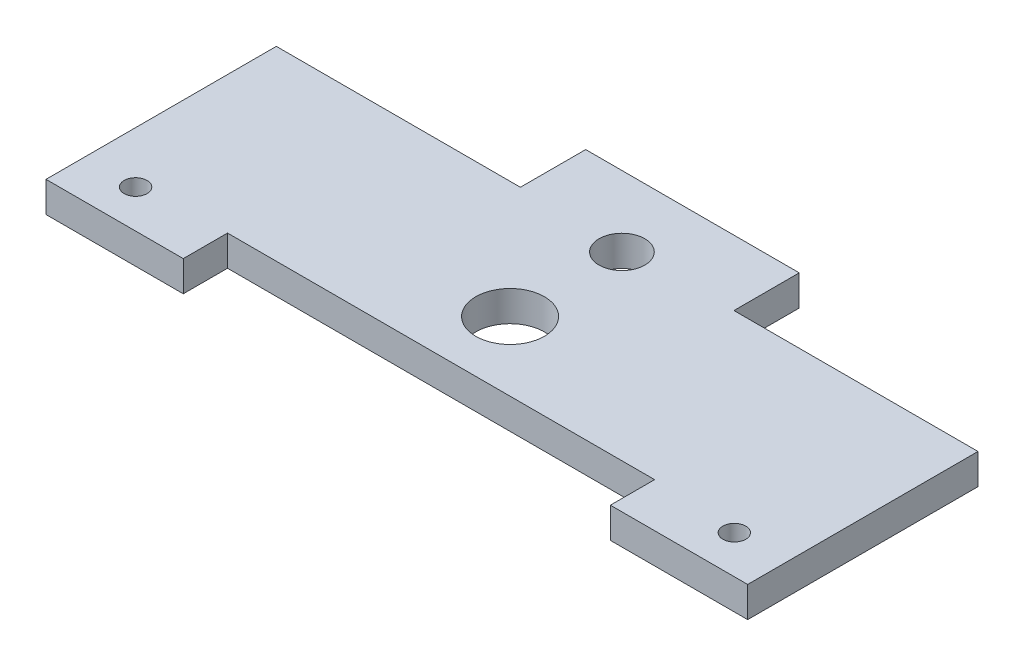
ISO-10303-21;
HEADER;
FILE_DESCRIPTION(('STEP AP214'),'2;1');
FILE_NAME('part.step','',(''),(''),'','','');
FILE_SCHEMA(('AUTOMOTIVE_DESIGN { 1 0 10303 214 1 1 1 1 }'));
ENDSEC;
DATA;
#1=APPLICATION_CONTEXT('core data for automotive mechanical design processes');
#2=APPLICATION_PROTOCOL_DEFINITION('international standard','automotive_design',2000,#1);
#3=PRODUCT_CONTEXT('',#1,'mechanical');
#4=PRODUCT('Part','Part','',(#3));
#5=PRODUCT_RELATED_PRODUCT_CATEGORY('part','',(#4));
#6=PRODUCT_DEFINITION_FORMATION('','',#4);
#7=PRODUCT_DEFINITION_CONTEXT('part definition',#1,'design');
#8=PRODUCT_DEFINITION('design','',#6,#7);
#9=PRODUCT_DEFINITION_SHAPE('','',#8);
#10=(LENGTH_UNIT() NAMED_UNIT(*) SI_UNIT(.MILLI.,.METRE.));
#11=(NAMED_UNIT(*) PLANE_ANGLE_UNIT() SI_UNIT($,.RADIAN.));
#12=(NAMED_UNIT(*) SI_UNIT($,.STERADIAN.) SOLID_ANGLE_UNIT());
#13=UNCERTAINTY_MEASURE_WITH_UNIT(LENGTH_MEASURE(1.E-05),#10,'distance_accuracy_value','');
#14=(GEOMETRIC_REPRESENTATION_CONTEXT(3) GLOBAL_UNCERTAINTY_ASSIGNED_CONTEXT((#13)) GLOBAL_UNIT_ASSIGNED_CONTEXT((#10,
#11,#12)) REPRESENTATION_CONTEXT('',''));
#15=CARTESIAN_POINT('',(0.,0.,0.));
#16=DIRECTION('',(0.,0.,1.));
#17=DIRECTION('',(1.,0.,0.));
#18=AXIS2_PLACEMENT_3D('',#15,#16,#17);
#19=CARTESIAN_POINT('',(0.,2.,0.));
#20=DIRECTION('',(0.,-1.,0.));
#21=DIRECTION('',(0.,0.,-1.));
#22=AXIS2_PLACEMENT_3D('',#19,#20,#21);
#23=PLANE('',#22);
#24=DIRECTION('',(-1.,0.,0.));
#25=VECTOR('',#24,1.);
#26=CARTESIAN_POINT('',(-23.,2.,-59.2649580649653));
#27=LINE('',#26,#25);
#28=CARTESIAN_POINT('',(-7.,2.,-59.2649580649653));
#29=VERTEX_POINT('',#28);
#30=CARTESIAN_POINT('',(-23.,2.,-59.2649580649653));
#31=VERTEX_POINT('',#30);
#32=EDGE_CURVE('E180',#29,#31,#27,.T.);
#33=ORIENTED_EDGE('',*,*,#32,.T.);
#34=DIRECTION('',(0.,0.,1.));
#35=VECTOR('',#34,1.);
#36=CARTESIAN_POINT('',(-23.,2.,-44.1642920578545));
#37=LINE('',#36,#35);
#38=CARTESIAN_POINT('',(-23.,2.,-44.1642920578545));
#39=VERTEX_POINT('',#38);
#40=EDGE_CURVE('E108',#31,#39,#37,.T.);
#41=ORIENTED_EDGE('',*,*,#40,.T.);
#42=DIRECTION('',(1.,0.,0.));
#43=VECTOR('',#42,1.);
#44=CARTESIAN_POINT('',(-23.,2.,-44.1642920578545));
#45=LINE('',#44,#43);
#46=CARTESIAN_POINT('',(-14.,2.,-44.1642920578545));
#47=VERTEX_POINT('',#46);
#48=EDGE_CURVE('E207',#39,#47,#45,.T.);
#49=ORIENTED_EDGE('',*,*,#48,.T.);
#50=DIRECTION('',(0.,0.,-1.));
#51=VECTOR('',#50,1.);
#52=CARTESIAN_POINT('',(-14.,2.,-44.1642920578545));
#53=LINE('',#52,#51);
#54=CARTESIAN_POINT('',(-14.,2.,-47.0642920578545));
#55=VERTEX_POINT('',#54);
#56=EDGE_CURVE('E226',#47,#55,#53,.T.);
#57=ORIENTED_EDGE('',*,*,#56,.T.);
#58=DIRECTION('',(1.,0.,0.));
#59=VECTOR('',#58,1.);
#60=CARTESIAN_POINT('',(-14.,2.,-47.0642920578545));
#61=LINE('',#60,#59);
#62=CARTESIAN_POINT('',(14.,2.,-47.0642920578545));
#63=VERTEX_POINT('',#62);
#64=EDGE_CURVE('E223',#55,#63,#61,.T.);
#65=ORIENTED_EDGE('',*,*,#64,.T.);
#66=DIRECTION('',(0.,0.,1.));
#67=VECTOR('',#66,1.);
#68=CARTESIAN_POINT('',(14.,2.,-44.1642920578545));
#69=LINE('',#68,#67);
#70=CARTESIAN_POINT('',(14.,2.,-44.1642920578545));
#71=VERTEX_POINT('',#70);
#72=EDGE_CURVE('E225',#63,#71,#69,.T.);
#73=ORIENTED_EDGE('',*,*,#72,.T.);
#74=DIRECTION('',(1.,0.,0.));
#75=VECTOR('',#74,1.);
#76=CARTESIAN_POINT('',(14.,2.,-44.1642920578545));
#77=LINE('',#76,#75);
#78=CARTESIAN_POINT('',(23.,2.,-44.1642920578545));
#79=VERTEX_POINT('',#78);
#80=EDGE_CURVE('E228',#71,#79,#77,.T.);
#81=ORIENTED_EDGE('',*,*,#80,.T.);
#82=DIRECTION('',(0.,0.,-1.));
#83=VECTOR('',#82,1.);
#84=CARTESIAN_POINT('',(23.,2.,-59.2649580649653));
#85=LINE('',#84,#83);
#86=CARTESIAN_POINT('',(23.,2.,-59.2649580649653));
#87=VERTEX_POINT('',#86);
#88=EDGE_CURVE('E234',#79,#87,#85,.T.);
#89=ORIENTED_EDGE('',*,*,#88,.T.);
#90=DIRECTION('',(-1.,0.,0.));
#91=VECTOR('',#90,1.);
#92=CARTESIAN_POINT('',(7.,2.,-59.2649580649653));
#93=LINE('',#92,#91);
#94=CARTESIAN_POINT('',(7.,2.,-59.2649580649653));
#95=VERTEX_POINT('',#94);
#96=EDGE_CURVE('E139',#87,#95,#93,.T.);
#97=ORIENTED_EDGE('',*,*,#96,.T.);
#98=DIRECTION('',(0.,0.,-1.));
#99=VECTOR('',#98,1.);
#100=CARTESIAN_POINT('',(7.,2.,-63.5456985010266));
#101=LINE('',#100,#99);
#102=CARTESIAN_POINT('',(7.,2.,-63.5456985010266));
#103=VERTEX_POINT('',#102);
#104=EDGE_CURVE('E133',#95,#103,#101,.T.);
#105=ORIENTED_EDGE('',*,*,#104,.T.);
#106=DIRECTION('',(-1.,0.,0.));
#107=VECTOR('',#106,1.);
#108=CARTESIAN_POINT('',(-7.,2.,-63.5456985010266));
#109=LINE('',#108,#107);
#110=CARTESIAN_POINT('',(-7.,2.,-63.5456985010266));
#111=VERTEX_POINT('',#110);
#112=EDGE_CURVE('E137',#103,#111,#109,.T.);
#113=ORIENTED_EDGE('',*,*,#112,.T.);
#114=DIRECTION('',(0.,0.,1.));
#115=VECTOR('',#114,1.);
#116=CARTESIAN_POINT('',(-7.,2.,-63.5456985010266));
#117=LINE('',#116,#115);
#118=EDGE_CURVE('E53',#111,#29,#117,.T.);
#119=ORIENTED_EDGE('',*,*,#118,.T.);
#120=EDGE_LOOP('',(#33,#41,#49,#57,#65,#73,#81,#89,#97,#105,#113,#119));
#121=FACE_BOUND('',#120,.T.);
#122=CARTESIAN_POINT('',(0.,2.,-58.9221504694254));
#123=DIRECTION('',(0.,1.,0.));
#124=DIRECTION('',(0.,0.,1.));
#125=AXIS2_PLACEMENT_3D('',#122,#123,#124);
#126=CIRCLE('',#125,1.5);
#127=CARTESIAN_POINT('',(0.,2.,-57.4221504694254));
#128=VERTEX_POINT('',#127);
#129=EDGE_CURVE('E161',#128,#128,#126,.T.);
#130=ORIENTED_EDGE('',*,*,#129,.F.);
#131=EDGE_LOOP('',(#130));
#132=FACE_BOUND('',#131,.T.);
#133=CARTESIAN_POINT('',(19.625,2.,-46.6642920578545));
#134=DIRECTION('',(0.,1.,0.));
#135=DIRECTION('',(0.,0.,1.));
#136=AXIS2_PLACEMENT_3D('',#133,#134,#135);
#137=CIRCLE('',#136,0.750000000000002);
#138=CARTESIAN_POINT('',(19.625,2.,-45.9142920578545));
#139=VERTEX_POINT('',#138);
#140=EDGE_CURVE('E298',#139,#139,#137,.T.);
#141=ORIENTED_EDGE('',*,*,#140,.F.);
#142=EDGE_LOOP('',(#141));
#143=FACE_BOUND('',#142,.T.);
#144=CARTESIAN_POINT('',(-19.625,2.,-46.6642920578545));
#145=DIRECTION('',(0.,1.,0.));
#146=DIRECTION('',(0.,0.,1.));
#147=AXIS2_PLACEMENT_3D('',#144,#145,#146);
#148=CIRCLE('',#147,0.750000000000002);
#149=CARTESIAN_POINT('',(-19.625,2.,-45.9142920578545));
#150=VERTEX_POINT('',#149);
#151=EDGE_CURVE('E292',#150,#150,#148,.T.);
#152=ORIENTED_EDGE('',*,*,#151,.F.);
#153=EDGE_LOOP('',(#152));
#154=FACE_BOUND('',#153,.T.);
#155=CARTESIAN_POINT('',(0.,2.,-51.5892920578545));
#156=DIRECTION('',(0.,1.,0.));
#157=DIRECTION('',(0.,0.,1.));
#158=AXIS2_PLACEMENT_3D('',#155,#156,#157);
#159=CIRCLE('',#158,2.25);
#160=CARTESIAN_POINT('',(0.,2.,-49.3392920578545));
#161=VERTEX_POINT('',#160);
#162=EDGE_CURVE('E283',#161,#161,#159,.T.);
#163=ORIENTED_EDGE('',*,*,#162,.F.);
#164=EDGE_LOOP('',(#163));
#165=FACE_BOUND('',#164,.T.);
#166=ADVANCED_FACE('F36',(#121,#132,#143,#154,#165),#23,.F.);
#167=CARTESIAN_POINT('',(0.,0.,0.));
#168=DIRECTION('',(0.,-1.,0.));
#169=DIRECTION('',(0.,0.,-1.));
#170=AXIS2_PLACEMENT_3D('',#167,#168,#169);
#171=PLANE('',#170);
#172=CARTESIAN_POINT('',(-19.625,0.,-46.6642920578545));
#173=DIRECTION('',(0.,1.,0.));
#174=DIRECTION('',(0.,0.,1.));
#175=AXIS2_PLACEMENT_3D('',#172,#173,#174);
#176=CIRCLE('',#175,0.750000000000002);
#177=CARTESIAN_POINT('',(-19.625,0.,-45.9142920578545));
#178=VERTEX_POINT('',#177);
#179=EDGE_CURVE('E289',#178,#178,#176,.T.);
#180=ORIENTED_EDGE('',*,*,#179,.T.);
#181=EDGE_LOOP('',(#180));
#182=FACE_BOUND('',#181,.T.);
#183=CARTESIAN_POINT('',(0.,0.,-58.9221504694254));
#184=DIRECTION('',(0.,1.,0.));
#185=DIRECTION('',(0.,0.,1.));
#186=AXIS2_PLACEMENT_3D('',#183,#184,#185);
#187=CIRCLE('',#186,1.5);
#188=CARTESIAN_POINT('',(0.,0.,-57.4221504694254));
#189=VERTEX_POINT('',#188);
#190=EDGE_CURVE('E301',#189,#189,#187,.T.);
#191=ORIENTED_EDGE('',*,*,#190,.T.);
#192=EDGE_LOOP('',(#191));
#193=FACE_BOUND('',#192,.T.);
#194=DIRECTION('',(-1.,0.,0.));
#195=VECTOR('',#194,1.);
#196=CARTESIAN_POINT('',(-23.,0.,-59.2649580649653));
#197=LINE('',#196,#195);
#198=CARTESIAN_POINT('',(-7.,0.,-59.2649580649653));
#199=VERTEX_POINT('',#198);
#200=CARTESIAN_POINT('',(-23.,0.,-59.2649580649653));
#201=VERTEX_POINT('',#200);
#202=EDGE_CURVE('E157',#199,#201,#197,.T.);
#203=ORIENTED_EDGE('',*,*,#202,.F.);
#204=DIRECTION('',(0.,0.,1.));
#205=VECTOR('',#204,1.);
#206=CARTESIAN_POINT('',(-7.,0.,-63.5456985010266));
#207=LINE('',#206,#205);
#208=CARTESIAN_POINT('',(-7.,0.,-63.5456985010266));
#209=VERTEX_POINT('',#208);
#210=EDGE_CURVE('E100',#209,#199,#207,.T.);
#211=ORIENTED_EDGE('',*,*,#210,.F.);
#212=DIRECTION('',(-1.,0.,0.));
#213=VECTOR('',#212,1.);
#214=CARTESIAN_POINT('',(-7.,0.,-63.5456985010266));
#215=LINE('',#214,#213);
#216=CARTESIAN_POINT('',(7.,0.,-63.5456985010266));
#217=VERTEX_POINT('',#216);
#218=EDGE_CURVE('E94',#217,#209,#215,.T.);
#219=ORIENTED_EDGE('',*,*,#218,.F.);
#220=DIRECTION('',(0.,0.,-1.));
#221=VECTOR('',#220,1.);
#222=CARTESIAN_POINT('',(7.,0.,-63.5456985010266));
#223=LINE('',#222,#221);
#224=CARTESIAN_POINT('',(7.,0.,-59.2649580649653));
#225=VERTEX_POINT('',#224);
#226=EDGE_CURVE('E147',#225,#217,#223,.T.);
#227=ORIENTED_EDGE('',*,*,#226,.F.);
#228=DIRECTION('',(-1.,0.,0.));
#229=VECTOR('',#228,1.);
#230=CARTESIAN_POINT('',(7.,0.,-59.2649580649653));
#231=LINE('',#230,#229);
#232=CARTESIAN_POINT('',(23.,0.,-59.2649580649653));
#233=VERTEX_POINT('',#232);
#234=EDGE_CURVE('E175',#233,#225,#231,.T.);
#235=ORIENTED_EDGE('',*,*,#234,.F.);
#236=DIRECTION('',(0.,0.,-1.));
#237=VECTOR('',#236,1.);
#238=CARTESIAN_POINT('',(23.,0.,-59.2649580649653));
#239=LINE('',#238,#237);
#240=CARTESIAN_POINT('',(23.,0.,-44.1642920578545));
#241=VERTEX_POINT('',#240);
#242=EDGE_CURVE('E173',#241,#233,#239,.T.);
#243=ORIENTED_EDGE('',*,*,#242,.F.);
#244=DIRECTION('',(1.,0.,0.));
#245=VECTOR('',#244,1.);
#246=CARTESIAN_POINT('',(14.,0.,-44.1642920578545));
#247=LINE('',#246,#245);
#248=CARTESIAN_POINT('',(14.,0.,-44.1642920578545));
#249=VERTEX_POINT('',#248);
#250=EDGE_CURVE('E171',#249,#241,#247,.T.);
#251=ORIENTED_EDGE('',*,*,#250,.F.);
#252=DIRECTION('',(0.,0.,1.));
#253=VECTOR('',#252,1.);
#254=CARTESIAN_POINT('',(14.,0.,-44.1642920578545));
#255=LINE('',#254,#253);
#256=CARTESIAN_POINT('',(14.,0.,-47.0642920578545));
#257=VERTEX_POINT('',#256);
#258=EDGE_CURVE('E169',#257,#249,#255,.T.);
#259=ORIENTED_EDGE('',*,*,#258,.F.);
#260=DIRECTION('',(1.,0.,0.));
#261=VECTOR('',#260,1.);
#262=CARTESIAN_POINT('',(-14.,0.,-47.0642920578545));
#263=LINE('',#262,#261);
#264=CARTESIAN_POINT('',(-14.,0.,-47.0642920578545));
#265=VERTEX_POINT('',#264);
#266=EDGE_CURVE('E167',#265,#257,#263,.T.);
#267=ORIENTED_EDGE('',*,*,#266,.F.);
#268=DIRECTION('',(0.,0.,-1.));
#269=VECTOR('',#268,1.);
#270=CARTESIAN_POINT('',(-14.,0.,-44.1642920578545));
#271=LINE('',#270,#269);
#272=CARTESIAN_POINT('',(-14.,0.,-44.1642920578545));
#273=VERTEX_POINT('',#272);
#274=EDGE_CURVE('E165',#273,#265,#271,.T.);
#275=ORIENTED_EDGE('',*,*,#274,.F.);
#276=DIRECTION('',(1.,0.,0.));
#277=VECTOR('',#276,1.);
#278=CARTESIAN_POINT('',(-23.,0.,-44.1642920578545));
#279=LINE('',#278,#277);
#280=CARTESIAN_POINT('',(-23.,0.,-44.1642920578545));
#281=VERTEX_POINT('',#280);
#282=EDGE_CURVE('E163',#281,#273,#279,.T.);
#283=ORIENTED_EDGE('',*,*,#282,.F.);
#284=DIRECTION('',(0.,0.,1.));
#285=VECTOR('',#284,1.);
#286=CARTESIAN_POINT('',(-23.,0.,-44.1642920578545));
#287=LINE('',#286,#285);
#288=EDGE_CURVE('E160',#201,#281,#287,.T.);
#289=ORIENTED_EDGE('',*,*,#288,.F.);
#290=EDGE_LOOP('',(#203,#211,#219,#227,#235,#243,#251,#259,#267,#275,#283,#289));
#291=FACE_BOUND('',#290,.T.);
#292=CARTESIAN_POINT('',(19.625,0.,-46.6642920578545));
#293=DIRECTION('',(0.,1.,0.));
#294=DIRECTION('',(0.,0.,1.));
#295=AXIS2_PLACEMENT_3D('',#292,#293,#294);
#296=CIRCLE('',#295,0.750000000000002);
#297=CARTESIAN_POINT('',(19.625,0.,-45.9142920578545));
#298=VERTEX_POINT('',#297);
#299=EDGE_CURVE('E295',#298,#298,#296,.T.);
#300=ORIENTED_EDGE('',*,*,#299,.T.);
#301=EDGE_LOOP('',(#300));
#302=FACE_BOUND('',#301,.T.);
#303=CARTESIAN_POINT('',(0.,0.,-51.5892920578545));
#304=DIRECTION('',(0.,1.,0.));
#305=DIRECTION('',(0.,0.,1.));
#306=AXIS2_PLACEMENT_3D('',#303,#304,#305);
#307=CIRCLE('',#306,2.25);
#308=CARTESIAN_POINT('',(0.,0.,-49.3392920578545));
#309=VERTEX_POINT('',#308);
#310=EDGE_CURVE('E286',#309,#309,#307,.T.);
#311=ORIENTED_EDGE('',*,*,#310,.T.);
#312=EDGE_LOOP('',(#311));
#313=FACE_BOUND('',#312,.T.);
#314=ADVANCED_FACE('F211',(#182,#193,#291,#302,#313),#171,.T.);
#315=CARTESIAN_POINT('',(-23.,2.,-59.2649580649653));
#316=DIRECTION('',(0.,0.,1.));
#317=DIRECTION('',(1.,0.,0.));
#318=AXIS2_PLACEMENT_3D('',#315,#316,#317);
#319=PLANE('',#318);
#320=ORIENTED_EDGE('',*,*,#202,.T.);
#321=DIRECTION('',(0.,-1.,0.));
#322=VECTOR('',#321,1.);
#323=CARTESIAN_POINT('',(-23.,2.,-59.2649580649653));
#324=LINE('',#323,#322);
#325=EDGE_CURVE('E11',#31,#201,#324,.T.);
#326=ORIENTED_EDGE('',*,*,#325,.F.);
#327=ORIENTED_EDGE('',*,*,#32,.F.);
#328=DIRECTION('',(0.,-1.,0.));
#329=VECTOR('',#328,1.);
#330=CARTESIAN_POINT('',(-7.,2.,-59.2649580649653));
#331=LINE('',#330,#329);
#332=EDGE_CURVE('E153',#29,#199,#331,.T.);
#333=ORIENTED_EDGE('',*,*,#332,.T.);
#334=EDGE_LOOP('',(#320,#326,#327,#333));
#335=FACE_BOUND('',#334,.T.);
#336=ADVANCED_FACE('F38',(#335),#319,.F.);
#337=CARTESIAN_POINT('',(-23.,2.,-44.1642920578545));
#338=DIRECTION('',(1.,0.,0.));
#339=DIRECTION('',(0.,0.,-1.));
#340=AXIS2_PLACEMENT_3D('',#337,#338,#339);
#341=PLANE('',#340);
#342=ORIENTED_EDGE('',*,*,#288,.T.);
#343=DIRECTION('',(0.,-1.,0.));
#344=VECTOR('',#343,1.);
#345=CARTESIAN_POINT('',(-23.,2.,-44.1642920578545));
#346=LINE('',#345,#344);
#347=EDGE_CURVE('E45',#39,#281,#346,.T.);
#348=ORIENTED_EDGE('',*,*,#347,.F.);
#349=ORIENTED_EDGE('',*,*,#40,.F.);
#350=ORIENTED_EDGE('',*,*,#325,.T.);
#351=EDGE_LOOP('',(#342,#348,#349,#350));
#352=FACE_BOUND('',#351,.T.);
#353=ADVANCED_FACE('F413',(#352),#341,.F.);
#354=CARTESIAN_POINT('',(-23.,2.,-44.1642920578545));
#355=DIRECTION('',(0.,0.,-1.));
#356=DIRECTION('',(-1.,0.,0.));
#357=AXIS2_PLACEMENT_3D('',#354,#355,#356);
#358=PLANE('',#357);
#359=ORIENTED_EDGE('',*,*,#282,.T.);
#360=DIRECTION('',(0.,-1.,0.));
#361=VECTOR('',#360,1.);
#362=CARTESIAN_POINT('',(-14.,2.,-44.1642920578545));
#363=LINE('',#362,#361);
#364=EDGE_CURVE('E199',#47,#273,#363,.T.);
#365=ORIENTED_EDGE('',*,*,#364,.F.);
#366=ORIENTED_EDGE('',*,*,#48,.F.);
#367=ORIENTED_EDGE('',*,*,#347,.T.);
#368=EDGE_LOOP('',(#359,#365,#366,#367));
#369=FACE_BOUND('',#368,.T.);
#370=ADVANCED_FACE('F205',(#369),#358,.F.);
#371=CARTESIAN_POINT('',(-14.,2.,-44.1642920578545));
#372=DIRECTION('',(-1.,0.,0.));
#373=DIRECTION('',(0.,0.,1.));
#374=AXIS2_PLACEMENT_3D('',#371,#372,#373);
#375=PLANE('',#374);
#376=ORIENTED_EDGE('',*,*,#274,.T.);
#377=DIRECTION('',(0.,-1.,0.));
#378=VECTOR('',#377,1.);
#379=CARTESIAN_POINT('',(-14.,2.,-47.0642920578545));
#380=LINE('',#379,#378);
#381=EDGE_CURVE('E196',#55,#265,#380,.T.);
#382=ORIENTED_EDGE('',*,*,#381,.F.);
#383=ORIENTED_EDGE('',*,*,#56,.F.);
#384=ORIENTED_EDGE('',*,*,#364,.T.);
#385=EDGE_LOOP('',(#376,#382,#383,#384));
#386=FACE_BOUND('',#385,.T.);
#387=ADVANCED_FACE('F217',(#386),#375,.F.);
#388=CARTESIAN_POINT('',(-14.,2.,-47.0642920578545));
#389=DIRECTION('',(0.,0.,-1.));
#390=DIRECTION('',(-1.,0.,0.));
#391=AXIS2_PLACEMENT_3D('',#388,#389,#390);
#392=PLANE('',#391);
#393=ORIENTED_EDGE('',*,*,#266,.T.);
#394=DIRECTION('',(0.,-1.,0.));
#395=VECTOR('',#394,1.);
#396=CARTESIAN_POINT('',(14.,2.,-47.0642920578545));
#397=LINE('',#396,#395);
#398=EDGE_CURVE('E193',#63,#257,#397,.T.);
#399=ORIENTED_EDGE('',*,*,#398,.F.);
#400=ORIENTED_EDGE('',*,*,#64,.F.);
#401=ORIENTED_EDGE('',*,*,#381,.T.);
#402=EDGE_LOOP('',(#393,#399,#400,#401));
#403=FACE_BOUND('',#402,.T.);
#404=ADVANCED_FACE('F221',(#403),#392,.F.);
#405=CARTESIAN_POINT('',(14.,2.,-44.1642920578545));
#406=DIRECTION('',(1.,0.,0.));
#407=DIRECTION('',(0.,0.,-1.));
#408=AXIS2_PLACEMENT_3D('',#405,#406,#407);
#409=PLANE('',#408);
#410=ORIENTED_EDGE('',*,*,#258,.T.);
#411=DIRECTION('',(0.,-1.,0.));
#412=VECTOR('',#411,1.);
#413=CARTESIAN_POINT('',(14.,2.,-44.1642920578545));
#414=LINE('',#413,#412);
#415=EDGE_CURVE('E190',#71,#249,#414,.T.);
#416=ORIENTED_EDGE('',*,*,#415,.F.);
#417=ORIENTED_EDGE('',*,*,#72,.F.);
#418=ORIENTED_EDGE('',*,*,#398,.T.);
#419=EDGE_LOOP('',(#410,#416,#417,#418));
#420=FACE_BOUND('',#419,.T.);
#421=ADVANCED_FACE('F378',(#420),#409,.F.);
#422=CARTESIAN_POINT('',(14.,2.,-44.1642920578545));
#423=DIRECTION('',(0.,0.,-1.));
#424=DIRECTION('',(-1.,0.,0.));
#425=AXIS2_PLACEMENT_3D('',#422,#423,#424);
#426=PLANE('',#425);
#427=ORIENTED_EDGE('',*,*,#250,.T.);
#428=DIRECTION('',(0.,-1.,0.));
#429=VECTOR('',#428,1.);
#430=CARTESIAN_POINT('',(23.,2.,-44.1642920578545));
#431=LINE('',#430,#429);
#432=EDGE_CURVE('E187',#79,#241,#431,.T.);
#433=ORIENTED_EDGE('',*,*,#432,.F.);
#434=ORIENTED_EDGE('',*,*,#80,.F.);
#435=ORIENTED_EDGE('',*,*,#415,.T.);
#436=EDGE_LOOP('',(#427,#433,#434,#435));
#437=FACE_BOUND('',#436,.T.);
#438=ADVANCED_FACE('F369',(#437),#426,.F.);
#439=CARTESIAN_POINT('',(23.,2.,-59.2649580649653));
#440=DIRECTION('',(-1.,0.,0.));
#441=DIRECTION('',(0.,0.,1.));
#442=AXIS2_PLACEMENT_3D('',#439,#440,#441);
#443=PLANE('',#442);
#444=ORIENTED_EDGE('',*,*,#242,.T.);
#445=DIRECTION('',(0.,-1.,0.));
#446=VECTOR('',#445,1.);
#447=CARTESIAN_POINT('',(23.,2.,-59.2649580649653));
#448=LINE('',#447,#446);
#449=EDGE_CURVE('E184',#87,#233,#448,.T.);
#450=ORIENTED_EDGE('',*,*,#449,.F.);
#451=ORIENTED_EDGE('',*,*,#88,.F.);
#452=ORIENTED_EDGE('',*,*,#432,.T.);
#453=EDGE_LOOP('',(#444,#450,#451,#452));
#454=FACE_BOUND('',#453,.T.);
#455=ADVANCED_FACE('F240',(#454),#443,.F.);
#456=CARTESIAN_POINT('',(7.,2.,-59.2649580649653));
#457=DIRECTION('',(0.,0.,1.));
#458=DIRECTION('',(1.,0.,0.));
#459=AXIS2_PLACEMENT_3D('',#456,#457,#458);
#460=PLANE('',#459);
#461=ORIENTED_EDGE('',*,*,#234,.T.);
#462=DIRECTION('',(0.,-1.,0.));
#463=VECTOR('',#462,1.);
#464=CARTESIAN_POINT('',(7.,2.,-59.2649580649653));
#465=LINE('',#464,#463);
#466=EDGE_CURVE('E148',#95,#225,#465,.T.);
#467=ORIENTED_EDGE('',*,*,#466,.F.);
#468=ORIENTED_EDGE('',*,*,#96,.F.);
#469=ORIENTED_EDGE('',*,*,#449,.T.);
#470=EDGE_LOOP('',(#461,#467,#468,#469));
#471=FACE_BOUND('',#470,.T.);
#472=ADVANCED_FACE('F244',(#471),#460,.F.);
#473=CARTESIAN_POINT('',(7.,2.,-63.5456985010266));
#474=DIRECTION('',(-1.,0.,0.));
#475=DIRECTION('',(0.,0.,1.));
#476=AXIS2_PLACEMENT_3D('',#473,#474,#475);
#477=PLANE('',#476);
#478=ORIENTED_EDGE('',*,*,#226,.T.);
#479=DIRECTION('',(0.,-1.,0.));
#480=VECTOR('',#479,1.);
#481=CARTESIAN_POINT('',(7.,2.,-63.5456985010266));
#482=LINE('',#481,#480);
#483=EDGE_CURVE('E144',#103,#217,#482,.T.);
#484=ORIENTED_EDGE('',*,*,#483,.F.);
#485=ORIENTED_EDGE('',*,*,#104,.F.);
#486=ORIENTED_EDGE('',*,*,#466,.T.);
#487=EDGE_LOOP('',(#478,#484,#485,#486));
#488=FACE_BOUND('',#487,.T.);
#489=ADVANCED_FACE('F145',(#488),#477,.F.);
#490=CARTESIAN_POINT('',(-7.,2.,-63.5456985010266));
#491=DIRECTION('',(0.,0.,1.));
#492=DIRECTION('',(1.,0.,0.));
#493=AXIS2_PLACEMENT_3D('',#490,#491,#492);
#494=PLANE('',#493);
#495=ORIENTED_EDGE('',*,*,#218,.T.);
#496=DIRECTION('',(0.,-1.,0.));
#497=VECTOR('',#496,1.);
#498=CARTESIAN_POINT('',(-7.,2.,-63.5456985010266));
#499=LINE('',#498,#497);
#500=EDGE_CURVE('E149',#111,#209,#499,.T.);
#501=ORIENTED_EDGE('',*,*,#500,.F.);
#502=ORIENTED_EDGE('',*,*,#112,.F.);
#503=ORIENTED_EDGE('',*,*,#483,.T.);
#504=EDGE_LOOP('',(#495,#501,#502,#503));
#505=FACE_BOUND('',#504,.T.);
#506=ADVANCED_FACE('F151',(#505),#494,.F.);
#507=CARTESIAN_POINT('',(-7.,2.,-63.5456985010266));
#508=DIRECTION('',(1.,0.,0.));
#509=DIRECTION('',(0.,0.,-1.));
#510=AXIS2_PLACEMENT_3D('',#507,#508,#509);
#511=PLANE('',#510);
#512=ORIENTED_EDGE('',*,*,#210,.T.);
#513=ORIENTED_EDGE('',*,*,#332,.F.);
#514=ORIENTED_EDGE('',*,*,#118,.F.);
#515=ORIENTED_EDGE('',*,*,#500,.T.);
#516=EDGE_LOOP('',(#512,#513,#514,#515));
#517=FACE_BOUND('',#516,.T.);
#518=ADVANCED_FACE('F248',(#517),#511,.F.);
#519=CARTESIAN_POINT('',(0.,2.,-58.9221504694254));
#520=DIRECTION('',(0.,-1.,0.));
#521=DIRECTION('',(0.,0.,-1.));
#522=AXIS2_PLACEMENT_3D('',#519,#520,#521);
#523=CYLINDRICAL_SURFACE('',#522,1.5);
#524=ORIENTED_EDGE('',*,*,#129,.T.);
#525=EDGE_LOOP('',(#524));
#526=FACE_BOUND('',#525,.T.);
#527=ORIENTED_EDGE('',*,*,#190,.F.);
#528=EDGE_LOOP('',(#527));
#529=FACE_BOUND('',#528,.T.);
#530=ADVANCED_FACE('F250',(#526,#529),#523,.F.);
#531=CARTESIAN_POINT('',(19.625,2.,-46.6642920578545));
#532=DIRECTION('',(0.,-1.,0.));
#533=DIRECTION('',(0.,0.,-1.));
#534=AXIS2_PLACEMENT_3D('',#531,#532,#533);
#535=CYLINDRICAL_SURFACE('',#534,0.750000000000002);
#536=ORIENTED_EDGE('',*,*,#140,.T.);
#537=EDGE_LOOP('',(#536));
#538=FACE_BOUND('',#537,.T.);
#539=ORIENTED_EDGE('',*,*,#299,.F.);
#540=EDGE_LOOP('',(#539));
#541=FACE_BOUND('',#540,.T.);
#542=ADVANCED_FACE('F256',(#538,#541),#535,.F.);
#543=CARTESIAN_POINT('',(-19.625,2.,-46.6642920578545));
#544=DIRECTION('',(0.,-1.,0.));
#545=DIRECTION('',(0.,0.,-1.));
#546=AXIS2_PLACEMENT_3D('',#543,#544,#545);
#547=CYLINDRICAL_SURFACE('',#546,0.750000000000002);
#548=ORIENTED_EDGE('',*,*,#151,.T.);
#549=EDGE_LOOP('',(#548));
#550=FACE_BOUND('',#549,.T.);
#551=ORIENTED_EDGE('',*,*,#179,.F.);
#552=EDGE_LOOP('',(#551));
#553=FACE_BOUND('',#552,.T.);
#554=ADVANCED_FACE('F270',(#550,#553),#547,.F.);
#555=CARTESIAN_POINT('',(0.,2.,-51.5892920578545));
#556=DIRECTION('',(0.,-1.,0.));
#557=DIRECTION('',(0.,0.,-1.));
#558=AXIS2_PLACEMENT_3D('',#555,#556,#557);
#559=CYLINDRICAL_SURFACE('',#558,2.25);
#560=ORIENTED_EDGE('',*,*,#162,.T.);
#561=EDGE_LOOP('',(#560));
#562=FACE_BOUND('',#561,.T.);
#563=ORIENTED_EDGE('',*,*,#310,.F.);
#564=EDGE_LOOP('',(#563));
#565=FACE_BOUND('',#564,.T.);
#566=ADVANCED_FACE('F274',(#562,#565),#559,.F.);
#567=CLOSED_SHELL('',(#166,#314,#336,#353,#370,#387,#404,#421,#438,#455,#472,#489,#506,#518,
#530,#542,#554,#566));
#568=MANIFOLD_SOLID_BREP('B2',#567);
#569=ADVANCED_BREP_SHAPE_REPRESENTATION('',(#18,#568),#14);
#570=SHAPE_DEFINITION_REPRESENTATION(#9,#569);
ENDSEC;
END-ISO-10303-21;
